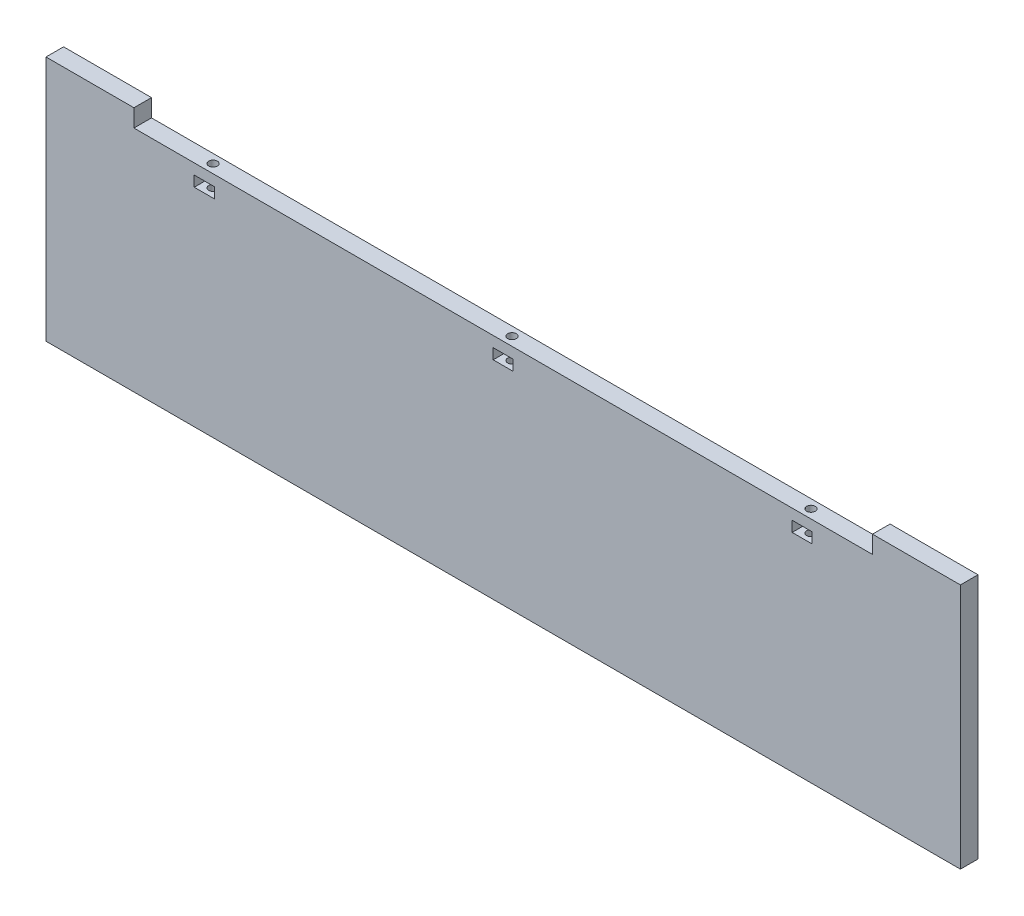
ISO-10303-21;
HEADER;
FILE_DESCRIPTION(('STEP AP214'),'2;1');
FILE_NAME('part.step','',(''),(''),'','','');
FILE_SCHEMA(('AUTOMOTIVE_DESIGN { 1 0 10303 214 1 1 1 1 }'));
ENDSEC;
DATA;
#1=APPLICATION_CONTEXT('core data for automotive mechanical design processes');
#2=APPLICATION_PROTOCOL_DEFINITION('international standard','automotive_design',2000,#1);
#3=PRODUCT_CONTEXT('',#1,'mechanical');
#4=PRODUCT('Part','Part','',(#3));
#5=PRODUCT_RELATED_PRODUCT_CATEGORY('part','',(#4));
#6=PRODUCT_DEFINITION_FORMATION('','',#4);
#7=PRODUCT_DEFINITION_CONTEXT('part definition',#1,'design');
#8=PRODUCT_DEFINITION('design','',#6,#7);
#9=PRODUCT_DEFINITION_SHAPE('','',#8);
#10=(LENGTH_UNIT() NAMED_UNIT(*) SI_UNIT(.MILLI.,.METRE.));
#11=(NAMED_UNIT(*) PLANE_ANGLE_UNIT() SI_UNIT($,.RADIAN.));
#12=(NAMED_UNIT(*) SI_UNIT($,.STERADIAN.) SOLID_ANGLE_UNIT());
#13=UNCERTAINTY_MEASURE_WITH_UNIT(LENGTH_MEASURE(1.E-05),#10,'distance_accuracy_value','');
#14=(GEOMETRIC_REPRESENTATION_CONTEXT(3) GLOBAL_UNCERTAINTY_ASSIGNED_CONTEXT((#13)) GLOBAL_UNIT_ASSIGNED_CONTEXT((#10,
#11,#12)) REPRESENTATION_CONTEXT('',''));
#15=CARTESIAN_POINT('',(0.,0.,0.));
#16=DIRECTION('',(0.,0.,1.));
#17=DIRECTION('',(1.,0.,0.));
#18=AXIS2_PLACEMENT_3D('',#15,#16,#17);
#19=CARTESIAN_POINT('',(127.85,61.9999999999999,5.));
#20=DIRECTION('',(1.,0.,0.));
#21=DIRECTION('',(0.,1.,0.));
#22=AXIS2_PLACEMENT_3D('',#19,#20,#21);
#23=PLANE('',#22);
#24=DIRECTION('',(0.,1.,0.));
#25=VECTOR('',#24,1.);
#26=CARTESIAN_POINT('',(127.85,47.9589552238806,0.));
#27=LINE('',#26,#25);
#28=CARTESIAN_POINT('',(127.85,59.,0.));
#29=VERTEX_POINT('',#28);
#30=CARTESIAN_POINT('',(127.85,61.9999999999999,0.));
#31=VERTEX_POINT('',#30);
#32=EDGE_CURVE('E157',#29,#31,#27,.T.);
#33=ORIENTED_EDGE('',*,*,#32,.F.);
#34=DIRECTION('',(0.,0.,-1.));
#35=VECTOR('',#34,1.);
#36=CARTESIAN_POINT('',(127.85,59.,5.));
#37=LINE('',#36,#35);
#38=CARTESIAN_POINT('',(127.85,59.,5.));
#39=VERTEX_POINT('',#38);
#40=EDGE_CURVE('E25',#39,#29,#37,.T.);
#41=ORIENTED_EDGE('',*,*,#40,.F.);
#42=DIRECTION('',(0.,-1.,0.));
#43=VECTOR('',#42,1.);
#44=CARTESIAN_POINT('',(127.85,47.9589552238806,5.));
#45=LINE('',#44,#43);
#46=CARTESIAN_POINT('',(127.85,61.9999999999999,5.));
#47=VERTEX_POINT('',#46);
#48=EDGE_CURVE('E188',#47,#39,#45,.T.);
#49=ORIENTED_EDGE('',*,*,#48,.F.);
#50=DIRECTION('',(0.,0.,-1.));
#51=VECTOR('',#50,1.);
#52=CARTESIAN_POINT('',(127.85,61.9999999999999,5.));
#53=LINE('',#52,#51);
#54=EDGE_CURVE('E11',#47,#31,#53,.T.);
#55=ORIENTED_EDGE('',*,*,#54,.T.);
#56=EDGE_LOOP('',(#33,#41,#49,#55));
#57=FACE_BOUND('',#56,.T.);
#58=ADVANCED_FACE('F16',(#57),#23,.F.);
#59=CARTESIAN_POINT('',(127.85,59.,5.));
#60=DIRECTION('',(0.,-1.,0.));
#61=DIRECTION('',(1.,0.,0.));
#62=AXIS2_PLACEMENT_3D('',#59,#60,#61);
#63=PLANE('',#62);
#64=DIRECTION('',(1.,0.,0.));
#65=VECTOR('',#64,1.);
#66=CARTESIAN_POINT('',(126.425,59.,0.));
#67=LINE('',#66,#65);
#68=CARTESIAN_POINT('',(122.15,59.,0.));
#69=VERTEX_POINT('',#68);
#70=EDGE_CURVE('E164',#69,#29,#67,.T.);
#71=ORIENTED_EDGE('',*,*,#70,.F.);
#72=DIRECTION('',(0.,0.,-1.));
#73=VECTOR('',#72,1.);
#74=CARTESIAN_POINT('',(122.15,59.,5.));
#75=LINE('',#74,#73);
#76=CARTESIAN_POINT('',(122.15,59.,5.));
#77=VERTEX_POINT('',#76);
#78=EDGE_CURVE('E184',#77,#69,#75,.T.);
#79=ORIENTED_EDGE('',*,*,#78,.F.);
#80=DIRECTION('',(-1.,0.,0.));
#81=VECTOR('',#80,1.);
#82=CARTESIAN_POINT('',(126.425,59.,5.));
#83=LINE('',#82,#81);
#84=EDGE_CURVE('E172',#39,#77,#83,.T.);
#85=ORIENTED_EDGE('',*,*,#84,.F.);
#86=ORIENTED_EDGE('',*,*,#40,.T.);
#87=EDGE_LOOP('',(#71,#79,#85,#86));
#88=FACE_BOUND('',#87,.T.);
#89=CARTESIAN_POINT('',(125.,58.9999999999999,2.5));
#90=DIRECTION('',(0.,1.,0.));
#91=DIRECTION('',(1.,0.,0.));
#92=AXIS2_PLACEMENT_3D('',#89,#90,#91);
#93=CIRCLE('',#92,1.2295);
#94=CARTESIAN_POINT('',(126.2295,58.9999999999999,2.5));
#95=VERTEX_POINT('',#94);
#96=EDGE_CURVE('E190',#95,#95,#93,.T.);
#97=ORIENTED_EDGE('',*,*,#96,.F.);
#98=EDGE_LOOP('',(#97));
#99=FACE_BOUND('',#98,.T.);
#100=ADVANCED_FACE('F168',(#88,#99),#63,.F.);
#101=CARTESIAN_POINT('',(122.15,61.9999999999999,5.));
#102=DIRECTION('',(0.,1.,0.));
#103=DIRECTION('',(-1.,0.,0.));
#104=AXIS2_PLACEMENT_3D('',#101,#102,#103);
#105=PLANE('',#104);
#106=DIRECTION('',(-1.,0.,0.));
#107=VECTOR('',#106,1.);
#108=CARTESIAN_POINT('',(123.575,61.9999999999999,0.));
#109=LINE('',#108,#107);
#110=CARTESIAN_POINT('',(122.15,61.9999999999999,0.));
#111=VERTEX_POINT('',#110);
#112=EDGE_CURVE('E180',#31,#111,#109,.T.);
#113=ORIENTED_EDGE('',*,*,#112,.F.);
#114=ORIENTED_EDGE('',*,*,#54,.F.);
#115=DIRECTION('',(1.,0.,0.));
#116=VECTOR('',#115,1.);
#117=CARTESIAN_POINT('',(123.575,61.9999999999999,5.));
#118=LINE('',#117,#116);
#119=CARTESIAN_POINT('',(122.15,61.9999999999999,5.));
#120=VERTEX_POINT('',#119);
#121=EDGE_CURVE('E197',#120,#47,#118,.T.);
#122=ORIENTED_EDGE('',*,*,#121,.F.);
#123=DIRECTION('',(0.,0.,-1.));
#124=VECTOR('',#123,1.);
#125=CARTESIAN_POINT('',(122.15,61.9999999999999,5.));
#126=LINE('',#125,#124);
#127=EDGE_CURVE('E173',#120,#111,#126,.T.);
#128=ORIENTED_EDGE('',*,*,#127,.T.);
#129=EDGE_LOOP('',(#113,#114,#122,#128));
#130=FACE_BOUND('',#129,.T.);
#131=CARTESIAN_POINT('',(125.,62.,2.5));
#132=DIRECTION('',(0.,-1.,0.));
#133=DIRECTION('',(0.,0.,-1.));
#134=AXIS2_PLACEMENT_3D('',#131,#132,#133);
#135=CIRCLE('',#134,1.2295);
#136=CARTESIAN_POINT('',(125.,62.,1.2705));
#137=VERTEX_POINT('',#136);
#138=EDGE_CURVE('E203',#137,#137,#135,.T.);
#139=ORIENTED_EDGE('',*,*,#138,.F.);
#140=EDGE_LOOP('',(#139));
#141=FACE_BOUND('',#140,.T.);
#142=ADVANCED_FACE('F405',(#130,#141),#105,.F.);
#143=CARTESIAN_POINT('',(122.15,59.,5.));
#144=DIRECTION('',(-1.,0.,0.));
#145=DIRECTION('',(0.,-1.,0.));
#146=AXIS2_PLACEMENT_3D('',#143,#144,#145);
#147=PLANE('',#146);
#148=DIRECTION('',(0.,-1.,0.));
#149=VECTOR('',#148,1.);
#150=CARTESIAN_POINT('',(122.15,46.4589552238806,0.));
#151=LINE('',#150,#149);
#152=EDGE_CURVE('E178',#111,#69,#151,.T.);
#153=ORIENTED_EDGE('',*,*,#152,.F.);
#154=ORIENTED_EDGE('',*,*,#127,.F.);
#155=DIRECTION('',(0.,1.,0.));
#156=VECTOR('',#155,1.);
#157=CARTESIAN_POINT('',(122.15,46.4589552238806,5.));
#158=LINE('',#157,#156);
#159=EDGE_CURVE('E189',#77,#120,#158,.T.);
#160=ORIENTED_EDGE('',*,*,#159,.F.);
#161=ORIENTED_EDGE('',*,*,#78,.T.);
#162=EDGE_LOOP('',(#153,#154,#160,#161));
#163=FACE_BOUND('',#162,.T.);
#164=ADVANCED_FACE('F410',(#163),#147,.F.);
#165=CARTESIAN_POINT('',(42.85,61.9999999999998,5.));
#166=DIRECTION('',(1.,0.,0.));
#167=DIRECTION('',(0.,1.,0.));
#168=AXIS2_PLACEMENT_3D('',#165,#166,#167);
#169=PLANE('',#168);
#170=DIRECTION('',(0.,1.,0.));
#171=VECTOR('',#170,1.);
#172=CARTESIAN_POINT('',(42.85,47.9589552238805,0.));
#173=LINE('',#172,#171);
#174=CARTESIAN_POINT('',(42.85,58.9999999999998,0.));
#175=VERTEX_POINT('',#174);
#176=CARTESIAN_POINT('',(42.85,61.9999999999998,0.));
#177=VERTEX_POINT('',#176);
#178=EDGE_CURVE('E211',#175,#177,#173,.T.);
#179=ORIENTED_EDGE('',*,*,#178,.F.);
#180=DIRECTION('',(0.,0.,-1.));
#181=VECTOR('',#180,1.);
#182=CARTESIAN_POINT('',(42.85,58.9999999999998,5.));
#183=LINE('',#182,#181);
#184=CARTESIAN_POINT('',(42.85,58.9999999999998,5.));
#185=VERTEX_POINT('',#184);
#186=EDGE_CURVE('E215',#185,#175,#183,.T.);
#187=ORIENTED_EDGE('',*,*,#186,.F.);
#188=DIRECTION('',(0.,-1.,0.));
#189=VECTOR('',#188,1.);
#190=CARTESIAN_POINT('',(42.85,47.9589552238805,5.));
#191=LINE('',#190,#189);
#192=CARTESIAN_POINT('',(42.85,61.9999999999998,5.));
#193=VERTEX_POINT('',#192);
#194=EDGE_CURVE('E220',#193,#185,#191,.T.);
#195=ORIENTED_EDGE('',*,*,#194,.F.);
#196=DIRECTION('',(0.,0.,-1.));
#197=VECTOR('',#196,1.);
#198=CARTESIAN_POINT('',(42.85,61.9999999999998,5.));
#199=LINE('',#198,#197);
#200=EDGE_CURVE('E186',#193,#177,#199,.T.);
#201=ORIENTED_EDGE('',*,*,#200,.T.);
#202=EDGE_LOOP('',(#179,#187,#195,#201));
#203=FACE_BOUND('',#202,.T.);
#204=ADVANCED_FACE('F414',(#203),#169,.F.);
#205=CARTESIAN_POINT('',(37.15,61.9999999999998,5.));
#206=DIRECTION('',(0.,1.,0.));
#207=DIRECTION('',(-1.,0.,0.));
#208=AXIS2_PLACEMENT_3D('',#205,#206,#207);
#209=PLANE('',#208);
#210=DIRECTION('',(-1.,0.,0.));
#211=VECTOR('',#210,1.);
#212=CARTESIAN_POINT('',(81.075,61.9999999999998,0.));
#213=LINE('',#212,#211);
#214=CARTESIAN_POINT('',(37.15,61.9999999999998,0.));
#215=VERTEX_POINT('',#214);
#216=EDGE_CURVE('E214',#177,#215,#213,.T.);
#217=ORIENTED_EDGE('',*,*,#216,.F.);
#218=ORIENTED_EDGE('',*,*,#200,.F.);
#219=DIRECTION('',(1.,0.,0.));
#220=VECTOR('',#219,1.);
#221=CARTESIAN_POINT('',(81.075,61.9999999999998,5.));
#222=LINE('',#221,#220);
#223=CARTESIAN_POINT('',(37.15,61.9999999999998,5.));
#224=VERTEX_POINT('',#223);
#225=EDGE_CURVE('E222',#224,#193,#222,.T.);
#226=ORIENTED_EDGE('',*,*,#225,.F.);
#227=DIRECTION('',(0.,0.,-1.));
#228=VECTOR('',#227,1.);
#229=CARTESIAN_POINT('',(37.15,61.9999999999998,5.));
#230=LINE('',#229,#228);
#231=EDGE_CURVE('E226',#224,#215,#230,.T.);
#232=ORIENTED_EDGE('',*,*,#231,.T.);
#233=EDGE_LOOP('',(#217,#218,#226,#232));
#234=FACE_BOUND('',#233,.T.);
#235=CARTESIAN_POINT('',(40.,61.9999999999998,2.5));
#236=DIRECTION('',(0.,-1.,0.));
#237=DIRECTION('',(0.,0.,-1.));
#238=AXIS2_PLACEMENT_3D('',#235,#236,#237);
#239=CIRCLE('',#238,1.2295);
#240=CARTESIAN_POINT('',(40.,61.9999999999998,1.2705));
#241=VERTEX_POINT('',#240);
#242=EDGE_CURVE('E194',#241,#241,#239,.T.);
#243=ORIENTED_EDGE('',*,*,#242,.F.);
#244=EDGE_LOOP('',(#243));
#245=FACE_BOUND('',#244,.T.);
#246=ADVANCED_FACE('F418',(#234,#245),#209,.F.);
#247=CARTESIAN_POINT('',(37.15,58.9999999999998,5.));
#248=DIRECTION('',(-1.,0.,0.));
#249=DIRECTION('',(0.,-1.,0.));
#250=AXIS2_PLACEMENT_3D('',#247,#248,#249);
#251=PLANE('',#250);
#252=DIRECTION('',(0.,-1.,0.));
#253=VECTOR('',#252,1.);
#254=CARTESIAN_POINT('',(37.15,46.4589552238805,0.));
#255=LINE('',#254,#253);
#256=CARTESIAN_POINT('',(37.15,58.9999999999998,0.));
#257=VERTEX_POINT('',#256);
#258=EDGE_CURVE('E165',#215,#257,#255,.T.);
#259=ORIENTED_EDGE('',*,*,#258,.F.);
#260=ORIENTED_EDGE('',*,*,#231,.F.);
#261=DIRECTION('',(0.,1.,0.));
#262=VECTOR('',#261,1.);
#263=CARTESIAN_POINT('',(37.15,46.4589552238805,5.));
#264=LINE('',#263,#262);
#265=CARTESIAN_POINT('',(37.15,58.9999999999998,5.));
#266=VERTEX_POINT('',#265);
#267=EDGE_CURVE('E210',#266,#224,#264,.T.);
#268=ORIENTED_EDGE('',*,*,#267,.F.);
#269=DIRECTION('',(0.,0.,-1.));
#270=VECTOR('',#269,1.);
#271=CARTESIAN_POINT('',(37.15,58.9999999999998,5.));
#272=LINE('',#271,#270);
#273=EDGE_CURVE('E218',#266,#257,#272,.T.);
#274=ORIENTED_EDGE('',*,*,#273,.T.);
#275=EDGE_LOOP('',(#259,#260,#268,#274));
#276=FACE_BOUND('',#275,.T.);
#277=ADVANCED_FACE('F422',(#276),#251,.F.);
#278=CARTESIAN_POINT('',(42.85,58.9999999999998,5.));
#279=DIRECTION('',(0.,-1.,0.));
#280=DIRECTION('',(1.,0.,0.));
#281=AXIS2_PLACEMENT_3D('',#278,#279,#280);
#282=PLANE('',#281);
#283=DIRECTION('',(1.,0.,0.));
#284=VECTOR('',#283,1.);
#285=CARTESIAN_POINT('',(83.925,58.9999999999999,0.));
#286=LINE('',#285,#284);
#287=EDGE_CURVE('E213',#257,#175,#286,.T.);
#288=ORIENTED_EDGE('',*,*,#287,.F.);
#289=ORIENTED_EDGE('',*,*,#273,.F.);
#290=DIRECTION('',(-1.,0.,0.));
#291=VECTOR('',#290,1.);
#292=CARTESIAN_POINT('',(83.925,58.9999999999999,5.));
#293=LINE('',#292,#291);
#294=EDGE_CURVE('E223',#185,#266,#293,.T.);
#295=ORIENTED_EDGE('',*,*,#294,.F.);
#296=ORIENTED_EDGE('',*,*,#186,.T.);
#297=EDGE_LOOP('',(#288,#289,#295,#296));
#298=FACE_BOUND('',#297,.T.);
#299=CARTESIAN_POINT('',(40.,58.9999999999998,2.5));
#300=DIRECTION('',(0.,1.,0.));
#301=DIRECTION('',(1.,0.,0.));
#302=AXIS2_PLACEMENT_3D('',#299,#300,#301);
#303=CIRCLE('',#302,1.2295);
#304=CARTESIAN_POINT('',(41.2295,58.9999999999998,2.5));
#305=VERTEX_POINT('',#304);
#306=EDGE_CURVE('E246',#305,#305,#303,.T.);
#307=ORIENTED_EDGE('',*,*,#306,.F.);
#308=EDGE_LOOP('',(#307));
#309=FACE_BOUND('',#308,.T.);
#310=ADVANCED_FACE('F426',(#298,#309),#282,.F.);
#311=CARTESIAN_POINT('',(212.85,62.0000000000001,5.));
#312=DIRECTION('',(1.,0.,0.));
#313=DIRECTION('',(0.,1.,0.));
#314=AXIS2_PLACEMENT_3D('',#311,#312,#313);
#315=PLANE('',#314);
#316=DIRECTION('',(0.,1.,0.));
#317=VECTOR('',#316,1.);
#318=CARTESIAN_POINT('',(212.85,47.9589552238807,0.));
#319=LINE('',#318,#317);
#320=CARTESIAN_POINT('',(212.85,59.0000000000001,0.));
#321=VERTEX_POINT('',#320);
#322=CARTESIAN_POINT('',(212.85,62.0000000000001,0.));
#323=VERTEX_POINT('',#322);
#324=EDGE_CURVE('E250',#321,#323,#319,.T.);
#325=ORIENTED_EDGE('',*,*,#324,.F.);
#326=DIRECTION('',(0.,0.,-1.));
#327=VECTOR('',#326,1.);
#328=CARTESIAN_POINT('',(212.85,59.0000000000001,5.));
#329=LINE('',#328,#327);
#330=CARTESIAN_POINT('',(212.85,59.0000000000001,5.));
#331=VERTEX_POINT('',#330);
#332=EDGE_CURVE('E193',#331,#321,#329,.T.);
#333=ORIENTED_EDGE('',*,*,#332,.F.);
#334=DIRECTION('',(0.,-1.,0.));
#335=VECTOR('',#334,1.);
#336=CARTESIAN_POINT('',(212.85,47.9589552238807,5.));
#337=LINE('',#336,#335);
#338=CARTESIAN_POINT('',(212.85,62.0000000000001,5.));
#339=VERTEX_POINT('',#338);
#340=EDGE_CURVE('E257',#339,#331,#337,.T.);
#341=ORIENTED_EDGE('',*,*,#340,.F.);
#342=DIRECTION('',(0.,0.,-1.));
#343=VECTOR('',#342,1.);
#344=CARTESIAN_POINT('',(212.85,62.0000000000001,5.));
#345=LINE('',#344,#343);
#346=EDGE_CURVE('E219',#339,#323,#345,.T.);
#347=ORIENTED_EDGE('',*,*,#346,.T.);
#348=EDGE_LOOP('',(#325,#333,#341,#347));
#349=FACE_BOUND('',#348,.T.);
#350=ADVANCED_FACE('F430',(#349),#315,.F.);
#351=CARTESIAN_POINT('',(207.15,62.0000000000001,5.));
#352=DIRECTION('',(0.,1.,0.));
#353=DIRECTION('',(-1.,0.,0.));
#354=AXIS2_PLACEMENT_3D('',#351,#352,#353);
#355=PLANE('',#354);
#356=DIRECTION('',(-1.,0.,0.));
#357=VECTOR('',#356,1.);
#358=CARTESIAN_POINT('',(166.075,62.,0.));
#359=LINE('',#358,#357);
#360=CARTESIAN_POINT('',(207.15,62.0000000000001,0.));
#361=VERTEX_POINT('',#360);
#362=EDGE_CURVE('E253',#323,#361,#359,.T.);
#363=ORIENTED_EDGE('',*,*,#362,.F.);
#364=ORIENTED_EDGE('',*,*,#346,.F.);
#365=DIRECTION('',(1.,0.,0.));
#366=VECTOR('',#365,1.);
#367=CARTESIAN_POINT('',(166.075,62.,5.));
#368=LINE('',#367,#366);
#369=CARTESIAN_POINT('',(207.15,62.0000000000001,5.));
#370=VERTEX_POINT('',#369);
#371=EDGE_CURVE('E259',#370,#339,#368,.T.);
#372=ORIENTED_EDGE('',*,*,#371,.F.);
#373=DIRECTION('',(0.,0.,-1.));
#374=VECTOR('',#373,1.);
#375=CARTESIAN_POINT('',(207.15,62.0000000000001,5.));
#376=LINE('',#375,#374);
#377=EDGE_CURVE('E263',#370,#361,#376,.T.);
#378=ORIENTED_EDGE('',*,*,#377,.T.);
#379=EDGE_LOOP('',(#363,#364,#372,#378));
#380=FACE_BOUND('',#379,.T.);
#381=CARTESIAN_POINT('',(210.,62.0000000000001,2.5));
#382=DIRECTION('',(0.,-1.,0.));
#383=DIRECTION('',(0.,0.,-1.));
#384=AXIS2_PLACEMENT_3D('',#381,#382,#383);
#385=CIRCLE('',#384,1.2295);
#386=CARTESIAN_POINT('',(210.,62.0000000000001,1.2705));
#387=VERTEX_POINT('',#386);
#388=EDGE_CURVE('E235',#387,#387,#385,.T.);
#389=ORIENTED_EDGE('',*,*,#388,.F.);
#390=EDGE_LOOP('',(#389));
#391=FACE_BOUND('',#390,.T.);
#392=ADVANCED_FACE('F434',(#380,#391),#355,.F.);
#393=CARTESIAN_POINT('',(207.15,59.0000000000001,5.));
#394=DIRECTION('',(-1.,0.,0.));
#395=DIRECTION('',(0.,-1.,0.));
#396=AXIS2_PLACEMENT_3D('',#393,#394,#395);
#397=PLANE('',#396);
#398=DIRECTION('',(0.,-1.,0.));
#399=VECTOR('',#398,1.);
#400=CARTESIAN_POINT('',(207.15,46.4589552238807,0.));
#401=LINE('',#400,#399);
#402=CARTESIAN_POINT('',(207.15,59.0000000000001,0.));
#403=VERTEX_POINT('',#402);
#404=EDGE_CURVE('E228',#361,#403,#401,.T.);
#405=ORIENTED_EDGE('',*,*,#404,.F.);
#406=ORIENTED_EDGE('',*,*,#377,.F.);
#407=DIRECTION('',(0.,1.,0.));
#408=VECTOR('',#407,1.);
#409=CARTESIAN_POINT('',(207.15,46.4589552238807,5.));
#410=LINE('',#409,#408);
#411=CARTESIAN_POINT('',(207.15,59.0000000000001,5.));
#412=VERTEX_POINT('',#411);
#413=EDGE_CURVE('E245',#412,#370,#410,.T.);
#414=ORIENTED_EDGE('',*,*,#413,.F.);
#415=DIRECTION('',(0.,0.,-1.));
#416=VECTOR('',#415,1.);
#417=CARTESIAN_POINT('',(207.15,59.0000000000001,5.));
#418=LINE('',#417,#416);
#419=EDGE_CURVE('E256',#412,#403,#418,.T.);
#420=ORIENTED_EDGE('',*,*,#419,.T.);
#421=EDGE_LOOP('',(#405,#406,#414,#420));
#422=FACE_BOUND('',#421,.T.);
#423=ADVANCED_FACE('F438',(#422),#397,.F.);
#424=CARTESIAN_POINT('',(212.85,59.0000000000001,5.));
#425=DIRECTION('',(0.,-1.,0.));
#426=DIRECTION('',(1.,0.,0.));
#427=AXIS2_PLACEMENT_3D('',#424,#425,#426);
#428=PLANE('',#427);
#429=DIRECTION('',(1.,0.,0.));
#430=VECTOR('',#429,1.);
#431=CARTESIAN_POINT('',(168.925,59.,0.));
#432=LINE('',#431,#430);
#433=EDGE_CURVE('E252',#403,#321,#432,.T.);
#434=ORIENTED_EDGE('',*,*,#433,.F.);
#435=ORIENTED_EDGE('',*,*,#419,.F.);
#436=DIRECTION('',(-1.,0.,0.));
#437=VECTOR('',#436,1.);
#438=CARTESIAN_POINT('',(168.925,59.,5.));
#439=LINE('',#438,#437);
#440=EDGE_CURVE('E260',#331,#412,#439,.T.);
#441=ORIENTED_EDGE('',*,*,#440,.F.);
#442=ORIENTED_EDGE('',*,*,#332,.T.);
#443=EDGE_LOOP('',(#434,#435,#441,#442));
#444=FACE_BOUND('',#443,.T.);
#445=CARTESIAN_POINT('',(210.,59.0000000000001,2.5));
#446=DIRECTION('',(0.,1.,0.));
#447=DIRECTION('',(1.,0.,0.));
#448=AXIS2_PLACEMENT_3D('',#445,#446,#447);
#449=CIRCLE('',#448,1.2295);
#450=CARTESIAN_POINT('',(211.2295,59.0000000000001,2.5));
#451=VERTEX_POINT('',#450);
#452=EDGE_CURVE('E280',#451,#451,#449,.T.);
#453=ORIENTED_EDGE('',*,*,#452,.F.);
#454=EDGE_LOOP('',(#453));
#455=FACE_BOUND('',#454,.T.);
#456=ADVANCED_FACE('F442',(#444,#455),#428,.F.);
#457=CARTESIAN_POINT('',(125.,60.5999999999999,2.5));
#458=DIRECTION('',(0.,1.,0.));
#459=DIRECTION('',(1.,0.,0.));
#460=AXIS2_PLACEMENT_3D('',#457,#458,#459);
#461=CYLINDRICAL_SURFACE('',#460,1.2295);
#462=CARTESIAN_POINT('',(125.,56.1999999999999,2.5));
#463=DIRECTION('',(0.,1.,0.));
#464=DIRECTION('',(1.,0.,0.));
#465=AXIS2_PLACEMENT_3D('',#462,#463,#464);
#466=CIRCLE('',#465,1.2295);
#467=CARTESIAN_POINT('',(126.2295,56.1999999999999,2.5));
#468=VERTEX_POINT('',#467);
#469=EDGE_CURVE('E205',#468,#468,#466,.T.);
#470=ORIENTED_EDGE('',*,*,#469,.F.);
#471=EDGE_LOOP('',(#470));
#472=FACE_BOUND('',#471,.T.);
#473=ORIENTED_EDGE('',*,*,#96,.T.);
#474=EDGE_LOOP('',(#473));
#475=FACE_BOUND('',#474,.T.);
#476=ADVANCED_FACE('F446',(#472,#475),#461,.F.);
#477=CARTESIAN_POINT('',(40.,60.5999999999998,2.5));
#478=DIRECTION('',(0.,1.,0.));
#479=DIRECTION('',(1.,0.,0.));
#480=AXIS2_PLACEMENT_3D('',#477,#478,#479);
#481=CYLINDRICAL_SURFACE('',#480,1.2295);
#482=CARTESIAN_POINT('',(40.,64.9999999999998,2.5));
#483=DIRECTION('',(0.,-1.,0.));
#484=DIRECTION('',(0.,0.,-1.));
#485=AXIS2_PLACEMENT_3D('',#482,#483,#484);
#486=CIRCLE('',#485,1.2295);
#487=CARTESIAN_POINT('',(40.,64.9999999999998,1.2705));
#488=VERTEX_POINT('',#487);
#489=EDGE_CURVE('E286',#488,#488,#486,.T.);
#490=ORIENTED_EDGE('',*,*,#489,.F.);
#491=EDGE_LOOP('',(#490));
#492=FACE_BOUND('',#491,.T.);
#493=ORIENTED_EDGE('',*,*,#242,.T.);
#494=EDGE_LOOP('',(#493));
#495=FACE_BOUND('',#494,.T.);
#496=ADVANCED_FACE('F450',(#492,#495),#481,.F.);
#497=CARTESIAN_POINT('',(210.,60.6000000000001,2.5));
#498=DIRECTION('',(0.,1.,0.));
#499=DIRECTION('',(1.,0.,0.));
#500=AXIS2_PLACEMENT_3D('',#497,#498,#499);
#501=CYLINDRICAL_SURFACE('',#500,1.2295);
#502=CARTESIAN_POINT('',(210.,65.0000000000001,2.5));
#503=DIRECTION('',(0.,-1.,0.));
#504=DIRECTION('',(0.,0.,-1.));
#505=AXIS2_PLACEMENT_3D('',#502,#503,#504);
#506=CIRCLE('',#505,1.2295);
#507=CARTESIAN_POINT('',(210.,65.0000000000001,1.2705));
#508=VERTEX_POINT('',#507);
#509=EDGE_CURVE('E291',#508,#508,#506,.T.);
#510=ORIENTED_EDGE('',*,*,#509,.F.);
#511=EDGE_LOOP('',(#510));
#512=FACE_BOUND('',#511,.T.);
#513=ORIENTED_EDGE('',*,*,#388,.T.);
#514=EDGE_LOOP('',(#513));
#515=FACE_BOUND('',#514,.T.);
#516=ADVANCED_FACE('F454',(#512,#515),#501,.F.);
#517=CARTESIAN_POINT('',(40.,55.8306209344526,2.5));
#518=DIRECTION('',(0.,1.,0.));
#519=DIRECTION('',(1.,0.,0.));
#520=AXIS2_PLACEMENT_3D('',#517,#518,#519);
#521=CONICAL_SURFACE('',#520,0.61475,1.02974425867665);
#522=CARTESIAN_POINT('',(40.,55.4612418689054,2.5));
#523=VERTEX_POINT('',#522);
#524=VERTEX_LOOP('',#523);
#525=FACE_BOUND('',#524,.T.);
#526=CARTESIAN_POINT('',(40.,56.1999999999998,2.5));
#527=DIRECTION('',(0.,1.,0.));
#528=DIRECTION('',(1.,0.,0.));
#529=AXIS2_PLACEMENT_3D('',#526,#527,#528);
#530=CIRCLE('',#529,1.2295);
#531=CARTESIAN_POINT('',(41.2295,56.1999999999998,2.5));
#532=VERTEX_POINT('',#531);
#533=EDGE_CURVE('E249',#532,#532,#530,.T.);
#534=ORIENTED_EDGE('',*,*,#533,.T.);
#535=EDGE_LOOP('',(#534));
#536=FACE_BOUND('',#535,.T.);
#537=ADVANCED_FACE('F458',(#525,#536),#521,.F.);
#538=CARTESIAN_POINT('',(40.,60.5999999999998,2.5));
#539=DIRECTION('',(0.,1.,0.));
#540=DIRECTION('',(1.,0.,0.));
#541=AXIS2_PLACEMENT_3D('',#538,#539,#540);
#542=CYLINDRICAL_SURFACE('',#541,1.2295);
#543=ORIENTED_EDGE('',*,*,#306,.T.);
#544=EDGE_LOOP('',(#543));
#545=FACE_BOUND('',#544,.T.);
#546=ORIENTED_EDGE('',*,*,#533,.F.);
#547=EDGE_LOOP('',(#546));
#548=FACE_BOUND('',#547,.T.);
#549=ADVANCED_FACE('F462',(#545,#548),#542,.F.);
#550=CARTESIAN_POINT('',(125.,55.8306209344527,2.5));
#551=DIRECTION('',(0.,1.,0.));
#552=DIRECTION('',(1.,0.,0.));
#553=AXIS2_PLACEMENT_3D('',#550,#551,#552);
#554=CONICAL_SURFACE('',#553,0.61475,1.02974425867665);
#555=CARTESIAN_POINT('',(125.,55.4612418689056,2.5));
#556=VERTEX_POINT('',#555);
#557=VERTEX_LOOP('',#556);
#558=FACE_BOUND('',#557,.T.);
#559=ORIENTED_EDGE('',*,*,#469,.T.);
#560=EDGE_LOOP('',(#559));
#561=FACE_BOUND('',#560,.T.);
#562=ADVANCED_FACE('F466',(#558,#561),#554,.F.);
#563=CARTESIAN_POINT('',(125.,60.5999999999999,2.5));
#564=DIRECTION('',(0.,1.,0.));
#565=DIRECTION('',(1.,0.,0.));
#566=AXIS2_PLACEMENT_3D('',#563,#564,#565);
#567=CYLINDRICAL_SURFACE('',#566,1.2295);
#568=ORIENTED_EDGE('',*,*,#138,.T.);
#569=EDGE_LOOP('',(#568));
#570=FACE_BOUND('',#569,.T.);
#571=CARTESIAN_POINT('',(125.,64.9999999999999,2.5));
#572=DIRECTION('',(0.,-1.,0.));
#573=DIRECTION('',(0.,0.,-1.));
#574=AXIS2_PLACEMENT_3D('',#571,#572,#573);
#575=CIRCLE('',#574,1.2295);
#576=CARTESIAN_POINT('',(125.,64.9999999999999,1.2705));
#577=VERTEX_POINT('',#576);
#578=EDGE_CURVE('E290',#577,#577,#575,.T.);
#579=ORIENTED_EDGE('',*,*,#578,.F.);
#580=EDGE_LOOP('',(#579));
#581=FACE_BOUND('',#580,.T.);
#582=ADVANCED_FACE('F470',(#570,#581),#567,.F.);
#583=CARTESIAN_POINT('',(210.,55.8306209344529,2.5));
#584=DIRECTION('',(0.,1.,0.));
#585=DIRECTION('',(1.,0.,0.));
#586=AXIS2_PLACEMENT_3D('',#583,#584,#585);
#587=CONICAL_SURFACE('',#586,0.61475,1.02974425867665);
#588=CARTESIAN_POINT('',(210.,55.4612418689057,2.5));
#589=VERTEX_POINT('',#588);
#590=VERTEX_LOOP('',#589);
#591=FACE_BOUND('',#590,.T.);
#592=CARTESIAN_POINT('',(210.,56.2000000000001,2.5));
#593=DIRECTION('',(0.,1.,0.));
#594=DIRECTION('',(1.,0.,0.));
#595=AXIS2_PLACEMENT_3D('',#592,#593,#594);
#596=CIRCLE('',#595,1.2295);
#597=CARTESIAN_POINT('',(211.2295,56.2000000000001,2.5));
#598=VERTEX_POINT('',#597);
#599=EDGE_CURVE('E206',#598,#598,#596,.T.);
#600=ORIENTED_EDGE('',*,*,#599,.T.);
#601=EDGE_LOOP('',(#600));
#602=FACE_BOUND('',#601,.T.);
#603=ADVANCED_FACE('F473',(#591,#602),#587,.F.);
#604=CARTESIAN_POINT('',(210.,60.6000000000001,2.5));
#605=DIRECTION('',(0.,1.,0.));
#606=DIRECTION('',(1.,0.,0.));
#607=AXIS2_PLACEMENT_3D('',#604,#605,#606);
#608=CYLINDRICAL_SURFACE('',#607,1.2295);
#609=ORIENTED_EDGE('',*,*,#452,.T.);
#610=EDGE_LOOP('',(#609));
#611=FACE_BOUND('',#610,.T.);
#612=ORIENTED_EDGE('',*,*,#599,.F.);
#613=EDGE_LOOP('',(#612));
#614=FACE_BOUND('',#613,.T.);
#615=ADVANCED_FACE('F477',(#611,#614),#608,.F.);
#616=CARTESIAN_POINT('',(-5.00000000000005,69.9999999999997,0.));
#617=DIRECTION('',(-1.,0.,0.));
#618=DIRECTION('',(0.,-1.,0.));
#619=AXIS2_PLACEMENT_3D('',#616,#617,#618);
#620=PLANE('',#619);
#621=DIRECTION('',(0.,-1.,0.));
#622=VECTOR('',#621,1.);
#623=CARTESIAN_POINT('',(-5.00000000000005,69.9999999999997,0.));
#624=LINE('',#623,#622);
#625=CARTESIAN_POINT('',(-5.00000000000005,69.9999999999997,0.));
#626=VERTEX_POINT('',#625);
#627=CARTESIAN_POINT('',(-4.99999999999996,0.,0.));
#628=VERTEX_POINT('',#627);
#629=EDGE_CURVE('E283',#626,#628,#624,.T.);
#630=ORIENTED_EDGE('',*,*,#629,.T.);
#631=DIRECTION('',(0.,0.,1.));
#632=VECTOR('',#631,1.);
#633=CARTESIAN_POINT('',(-4.99999999999996,0.,0.));
#634=LINE('',#633,#632);
#635=CARTESIAN_POINT('',(-4.99999999999996,0.,5.));
#636=VERTEX_POINT('',#635);
#637=EDGE_CURVE('E303',#628,#636,#634,.T.);
#638=ORIENTED_EDGE('',*,*,#637,.T.);
#639=DIRECTION('',(0.,-1.,0.));
#640=VECTOR('',#639,1.);
#641=CARTESIAN_POINT('',(-5.00000000000005,69.9999999999997,5.));
#642=LINE('',#641,#640);
#643=CARTESIAN_POINT('',(-5.00000000000005,69.9999999999997,5.));
#644=VERTEX_POINT('',#643);
#645=EDGE_CURVE('E196',#644,#636,#642,.T.);
#646=ORIENTED_EDGE('',*,*,#645,.F.);
#647=DIRECTION('',(0.,0.,1.));
#648=VECTOR('',#647,1.);
#649=CARTESIAN_POINT('',(-5.00000000000005,69.9999999999997,0.));
#650=LINE('',#649,#648);
#651=EDGE_CURVE('E309',#626,#644,#650,.T.);
#652=ORIENTED_EDGE('',*,*,#651,.F.);
#653=EDGE_LOOP('',(#630,#638,#646,#652));
#654=FACE_BOUND('',#653,.T.);
#655=ADVANCED_FACE('F378',(#654),#620,.T.);
#656=CARTESIAN_POINT('',(20.,69.9999999999997,0.));
#657=DIRECTION('',(0.,1.,0.));
#658=DIRECTION('',(-1.,0.,0.));
#659=AXIS2_PLACEMENT_3D('',#656,#657,#658);
#660=PLANE('',#659);
#661=DIRECTION('',(-1.,0.,0.));
#662=VECTOR('',#661,1.);
#663=CARTESIAN_POINT('',(20.,69.9999999999997,0.));
#664=LINE('',#663,#662);
#665=CARTESIAN_POINT('',(20.,69.9999999999997,0.));
#666=VERTEX_POINT('',#665);
#667=EDGE_CURVE('E306',#666,#626,#664,.T.);
#668=ORIENTED_EDGE('',*,*,#667,.T.);
#669=ORIENTED_EDGE('',*,*,#651,.T.);
#670=DIRECTION('',(-1.,0.,0.));
#671=VECTOR('',#670,1.);
#672=CARTESIAN_POINT('',(20.,69.9999999999997,5.));
#673=LINE('',#672,#671);
#674=CARTESIAN_POINT('',(20.,69.9999999999997,5.));
#675=VERTEX_POINT('',#674);
#676=EDGE_CURVE('E308',#675,#644,#673,.T.);
#677=ORIENTED_EDGE('',*,*,#676,.F.);
#678=DIRECTION('',(0.,0.,1.));
#679=VECTOR('',#678,1.);
#680=CARTESIAN_POINT('',(20.,69.9999999999997,0.));
#681=LINE('',#680,#679);
#682=EDGE_CURVE('E289',#666,#675,#681,.T.);
#683=ORIENTED_EDGE('',*,*,#682,.F.);
#684=EDGE_LOOP('',(#668,#669,#677,#683));
#685=FACE_BOUND('',#684,.T.);
#686=ADVANCED_FACE('F380',(#685),#660,.T.);
#687=CARTESIAN_POINT('',(20.,64.9999999999998,0.));
#688=DIRECTION('',(1.,0.,0.));
#689=DIRECTION('',(0.,1.,0.));
#690=AXIS2_PLACEMENT_3D('',#687,#688,#689);
#691=PLANE('',#690);
#692=DIRECTION('',(0.,1.,0.));
#693=VECTOR('',#692,1.);
#694=CARTESIAN_POINT('',(20.,64.9999999999998,0.));
#695=LINE('',#694,#693);
#696=CARTESIAN_POINT('',(20.,64.9999999999998,0.));
#697=VERTEX_POINT('',#696);
#698=EDGE_CURVE('E312',#697,#666,#695,.T.);
#699=ORIENTED_EDGE('',*,*,#698,.T.);
#700=ORIENTED_EDGE('',*,*,#682,.T.);
#701=DIRECTION('',(0.,1.,0.));
#702=VECTOR('',#701,1.);
#703=CARTESIAN_POINT('',(20.,64.9999999999998,5.));
#704=LINE('',#703,#702);
#705=CARTESIAN_POINT('',(20.,64.9999999999998,5.));
#706=VERTEX_POINT('',#705);
#707=EDGE_CURVE('E317',#706,#675,#704,.T.);
#708=ORIENTED_EDGE('',*,*,#707,.F.);
#709=DIRECTION('',(0.,0.,1.));
#710=VECTOR('',#709,1.);
#711=CARTESIAN_POINT('',(20.,64.9999999999998,0.));
#712=LINE('',#711,#710);
#713=EDGE_CURVE('E325',#697,#706,#712,.T.);
#714=ORIENTED_EDGE('',*,*,#713,.F.);
#715=EDGE_LOOP('',(#699,#700,#708,#714));
#716=FACE_BOUND('',#715,.T.);
#717=ADVANCED_FACE('F384',(#716),#691,.T.);
#718=CARTESIAN_POINT('',(230.,65.0000000000001,0.));
#719=DIRECTION('',(0.,1.,0.));
#720=DIRECTION('',(-1.,0.,0.));
#721=AXIS2_PLACEMENT_3D('',#718,#719,#720);
#722=PLANE('',#721);
#723=ORIENTED_EDGE('',*,*,#489,.T.);
#724=EDGE_LOOP('',(#723));
#725=FACE_BOUND('',#724,.T.);
#726=ORIENTED_EDGE('',*,*,#578,.T.);
#727=EDGE_LOOP('',(#726));
#728=FACE_BOUND('',#727,.T.);
#729=ORIENTED_EDGE('',*,*,#509,.T.);
#730=EDGE_LOOP('',(#729));
#731=FACE_BOUND('',#730,.T.);
#732=DIRECTION('',(-1.,0.,0.));
#733=VECTOR('',#732,1.);
#734=CARTESIAN_POINT('',(230.,65.0000000000001,0.));
#735=LINE('',#734,#733);
#736=CARTESIAN_POINT('',(230.,65.0000000000001,0.));
#737=VERTEX_POINT('',#736);
#738=EDGE_CURVE('E294',#737,#697,#735,.T.);
#739=ORIENTED_EDGE('',*,*,#738,.T.);
#740=ORIENTED_EDGE('',*,*,#713,.T.);
#741=DIRECTION('',(-1.,0.,0.));
#742=VECTOR('',#741,1.);
#743=CARTESIAN_POINT('',(230.,65.0000000000001,5.));
#744=LINE('',#743,#742);
#745=CARTESIAN_POINT('',(230.,65.0000000000001,5.));
#746=VERTEX_POINT('',#745);
#747=EDGE_CURVE('E324',#746,#706,#744,.T.);
#748=ORIENTED_EDGE('',*,*,#747,.F.);
#749=DIRECTION('',(0.,0.,1.));
#750=VECTOR('',#749,1.);
#751=CARTESIAN_POINT('',(230.,65.0000000000001,0.));
#752=LINE('',#751,#750);
#753=EDGE_CURVE('E334',#737,#746,#752,.T.);
#754=ORIENTED_EDGE('',*,*,#753,.F.);
#755=EDGE_LOOP('',(#739,#740,#748,#754));
#756=FACE_BOUND('',#755,.T.);
#757=ADVANCED_FACE('F386',(#725,#728,#731,#756),#722,.T.);
#758=CARTESIAN_POINT('',(230.,70.0000000000001,0.));
#759=DIRECTION('',(-1.,0.,0.));
#760=DIRECTION('',(0.,-1.,0.));
#761=AXIS2_PLACEMENT_3D('',#758,#759,#760);
#762=PLANE('',#761);
#763=DIRECTION('',(0.,-1.,0.));
#764=VECTOR('',#763,1.);
#765=CARTESIAN_POINT('',(230.,70.0000000000001,0.));
#766=LINE('',#765,#764);
#767=CARTESIAN_POINT('',(230.,70.0000000000001,0.));
#768=VERTEX_POINT('',#767);
#769=EDGE_CURVE('E328',#768,#737,#766,.T.);
#770=ORIENTED_EDGE('',*,*,#769,.T.);
#771=ORIENTED_EDGE('',*,*,#753,.T.);
#772=DIRECTION('',(0.,-1.,0.));
#773=VECTOR('',#772,1.);
#774=CARTESIAN_POINT('',(230.,70.0000000000001,5.));
#775=LINE('',#774,#773);
#776=CARTESIAN_POINT('',(230.,70.0000000000001,5.));
#777=VERTEX_POINT('',#776);
#778=EDGE_CURVE('E333',#777,#746,#775,.T.);
#779=ORIENTED_EDGE('',*,*,#778,.F.);
#780=DIRECTION('',(0.,0.,1.));
#781=VECTOR('',#780,1.);
#782=CARTESIAN_POINT('',(230.,70.0000000000001,0.));
#783=LINE('',#782,#781);
#784=EDGE_CURVE('E343',#768,#777,#783,.T.);
#785=ORIENTED_EDGE('',*,*,#784,.F.);
#786=EDGE_LOOP('',(#770,#771,#779,#785));
#787=FACE_BOUND('',#786,.T.);
#788=ADVANCED_FACE('F388',(#787),#762,.T.);
#789=CARTESIAN_POINT('',(255.,70.0000000000002,0.));
#790=DIRECTION('',(0.,1.,0.));
#791=DIRECTION('',(-1.,0.,0.));
#792=AXIS2_PLACEMENT_3D('',#789,#790,#791);
#793=PLANE('',#792);
#794=DIRECTION('',(-1.,0.,0.));
#795=VECTOR('',#794,1.);
#796=CARTESIAN_POINT('',(255.,70.0000000000002,0.));
#797=LINE('',#796,#795);
#798=CARTESIAN_POINT('',(255.,70.0000000000002,0.));
#799=VERTEX_POINT('',#798);
#800=EDGE_CURVE('E337',#799,#768,#797,.T.);
#801=ORIENTED_EDGE('',*,*,#800,.T.);
#802=ORIENTED_EDGE('',*,*,#784,.T.);
#803=DIRECTION('',(-1.,0.,0.));
#804=VECTOR('',#803,1.);
#805=CARTESIAN_POINT('',(255.,70.0000000000002,5.));
#806=LINE('',#805,#804);
#807=CARTESIAN_POINT('',(255.,70.0000000000002,5.));
#808=VERTEX_POINT('',#807);
#809=EDGE_CURVE('E342',#808,#777,#806,.T.);
#810=ORIENTED_EDGE('',*,*,#809,.F.);
#811=DIRECTION('',(0.,0.,1.));
#812=VECTOR('',#811,1.);
#813=CARTESIAN_POINT('',(255.,70.0000000000002,0.));
#814=LINE('',#813,#812);
#815=EDGE_CURVE('E352',#799,#808,#814,.T.);
#816=ORIENTED_EDGE('',*,*,#815,.F.);
#817=EDGE_LOOP('',(#801,#802,#810,#816));
#818=FACE_BOUND('',#817,.T.);
#819=ADVANCED_FACE('F390',(#818),#793,.T.);
#820=CARTESIAN_POINT('',(255.,3.72541736806596E-13,0.));
#821=DIRECTION('',(1.,0.,0.));
#822=DIRECTION('',(0.,1.,0.));
#823=AXIS2_PLACEMENT_3D('',#820,#821,#822);
#824=PLANE('',#823);
#825=DIRECTION('',(0.,1.,0.));
#826=VECTOR('',#825,1.);
#827=CARTESIAN_POINT('',(255.,3.72541736806596E-13,0.));
#828=LINE('',#827,#826);
#829=CARTESIAN_POINT('',(255.,3.72541736806596E-13,0.));
#830=VERTEX_POINT('',#829);
#831=EDGE_CURVE('E346',#830,#799,#828,.T.);
#832=ORIENTED_EDGE('',*,*,#831,.T.);
#833=ORIENTED_EDGE('',*,*,#815,.T.);
#834=DIRECTION('',(0.,1.,0.));
#835=VECTOR('',#834,1.);
#836=CARTESIAN_POINT('',(255.,3.72541736806596E-13,5.));
#837=LINE('',#836,#835);
#838=CARTESIAN_POINT('',(255.,3.72541736806596E-13,5.));
#839=VERTEX_POINT('',#838);
#840=EDGE_CURVE('E351',#839,#808,#837,.T.);
#841=ORIENTED_EDGE('',*,*,#840,.F.);
#842=DIRECTION('',(0.,0.,1.));
#843=VECTOR('',#842,1.);
#844=CARTESIAN_POINT('',(255.,3.72541736806596E-13,0.));
#845=LINE('',#844,#843);
#846=EDGE_CURVE('E200',#830,#839,#845,.T.);
#847=ORIENTED_EDGE('',*,*,#846,.F.);
#848=EDGE_LOOP('',(#832,#833,#841,#847));
#849=FACE_BOUND('',#848,.T.);
#850=ADVANCED_FACE('F374',(#849),#824,.T.);
#851=CARTESIAN_POINT('',(-4.99999999999996,0.,0.));
#852=DIRECTION('',(0.,-1.,0.));
#853=DIRECTION('',(1.,0.,0.));
#854=AXIS2_PLACEMENT_3D('',#851,#852,#853);
#855=PLANE('',#854);
#856=DIRECTION('',(1.,0.,0.));
#857=VECTOR('',#856,1.);
#858=CARTESIAN_POINT('',(-4.99999999999996,0.,0.));
#859=LINE('',#858,#857);
#860=EDGE_CURVE('E355',#628,#830,#859,.T.);
#861=ORIENTED_EDGE('',*,*,#860,.T.);
#862=ORIENTED_EDGE('',*,*,#846,.T.);
#863=DIRECTION('',(1.,0.,0.));
#864=VECTOR('',#863,1.);
#865=CARTESIAN_POINT('',(-4.99999999999996,0.,5.));
#866=LINE('',#865,#864);
#867=EDGE_CURVE('E20',#636,#839,#866,.T.);
#868=ORIENTED_EDGE('',*,*,#867,.F.);
#869=ORIENTED_EDGE('',*,*,#637,.F.);
#870=EDGE_LOOP('',(#861,#862,#868,#869));
#871=FACE_BOUND('',#870,.T.);
#872=ADVANCED_FACE('F364',(#871),#855,.T.);
#873=CARTESIAN_POINT('',(125.,33.9179104477613,5.));
#874=DIRECTION('',(0.,0.,1.));
#875=DIRECTION('',(1.,0.,0.));
#876=AXIS2_PLACEMENT_3D('',#873,#874,#875);
#877=PLANE('',#876);
#878=ORIENTED_EDGE('',*,*,#121,.T.);
#879=ORIENTED_EDGE('',*,*,#48,.T.);
#880=ORIENTED_EDGE('',*,*,#84,.T.);
#881=ORIENTED_EDGE('',*,*,#159,.T.);
#882=EDGE_LOOP('',(#878,#879,#880,#881));
#883=FACE_BOUND('',#882,.T.);
#884=ORIENTED_EDGE('',*,*,#267,.T.);
#885=ORIENTED_EDGE('',*,*,#225,.T.);
#886=ORIENTED_EDGE('',*,*,#194,.T.);
#887=ORIENTED_EDGE('',*,*,#294,.T.);
#888=EDGE_LOOP('',(#884,#885,#886,#887));
#889=FACE_BOUND('',#888,.T.);
#890=ORIENTED_EDGE('',*,*,#413,.T.);
#891=ORIENTED_EDGE('',*,*,#371,.T.);
#892=ORIENTED_EDGE('',*,*,#340,.T.);
#893=ORIENTED_EDGE('',*,*,#440,.T.);
#894=EDGE_LOOP('',(#890,#891,#892,#893));
#895=FACE_BOUND('',#894,.T.);
#896=ORIENTED_EDGE('',*,*,#867,.T.);
#897=ORIENTED_EDGE('',*,*,#840,.T.);
#898=ORIENTED_EDGE('',*,*,#809,.T.);
#899=ORIENTED_EDGE('',*,*,#778,.T.);
#900=ORIENTED_EDGE('',*,*,#747,.T.);
#901=ORIENTED_EDGE('',*,*,#707,.T.);
#902=ORIENTED_EDGE('',*,*,#676,.T.);
#903=ORIENTED_EDGE('',*,*,#645,.T.);
#904=EDGE_LOOP('',(#896,#897,#898,#899,#900,#901,#902,#903));
#905=FACE_BOUND('',#904,.T.);
#906=ADVANCED_FACE('F376',(#883,#889,#895,#905),#877,.T.);
#907=CARTESIAN_POINT('',(125.,33.9179104477613,0.));
#908=DIRECTION('',(0.,0.,1.));
#909=DIRECTION('',(0.,-1.,0.));
#910=AXIS2_PLACEMENT_3D('',#907,#908,#909);
#911=PLANE('',#910);
#912=ORIENTED_EDGE('',*,*,#112,.T.);
#913=ORIENTED_EDGE('',*,*,#152,.T.);
#914=ORIENTED_EDGE('',*,*,#70,.T.);
#915=ORIENTED_EDGE('',*,*,#32,.T.);
#916=EDGE_LOOP('',(#912,#913,#914,#915));
#917=FACE_BOUND('',#916,.T.);
#918=ORIENTED_EDGE('',*,*,#258,.T.);
#919=ORIENTED_EDGE('',*,*,#287,.T.);
#920=ORIENTED_EDGE('',*,*,#178,.T.);
#921=ORIENTED_EDGE('',*,*,#216,.T.);
#922=EDGE_LOOP('',(#918,#919,#920,#921));
#923=FACE_BOUND('',#922,.T.);
#924=ORIENTED_EDGE('',*,*,#404,.T.);
#925=ORIENTED_EDGE('',*,*,#433,.T.);
#926=ORIENTED_EDGE('',*,*,#324,.T.);
#927=ORIENTED_EDGE('',*,*,#362,.T.);
#928=EDGE_LOOP('',(#924,#925,#926,#927));
#929=FACE_BOUND('',#928,.T.);
#930=ORIENTED_EDGE('',*,*,#860,.F.);
#931=ORIENTED_EDGE('',*,*,#629,.F.);
#932=ORIENTED_EDGE('',*,*,#667,.F.);
#933=ORIENTED_EDGE('',*,*,#698,.F.);
#934=ORIENTED_EDGE('',*,*,#738,.F.);
#935=ORIENTED_EDGE('',*,*,#769,.F.);
#936=ORIENTED_EDGE('',*,*,#800,.F.);
#937=ORIENTED_EDGE('',*,*,#831,.F.);
#938=EDGE_LOOP('',(#930,#931,#932,#933,#934,#935,#936,#937));
#939=FACE_BOUND('',#938,.T.);
#940=ADVANCED_FACE('F18',(#917,#923,#929,#939),#911,.F.);
#941=CLOSED_SHELL('',(#58,#100,#142,#164,#204,#246,#277,#310,#350,#392,#423,#456,#476,#496,#516,
#537,#549,#562,#582,#603,#615,#655,#686,#717,#757,#788,#819,#850,#872,#906,#940));
#942=MANIFOLD_SOLID_BREP('B1',#941);
#943=ADVANCED_BREP_SHAPE_REPRESENTATION('',(#18,#942),#14);
#944=SHAPE_DEFINITION_REPRESENTATION(#9,#943);
ENDSEC;
END-ISO-10303-21;
